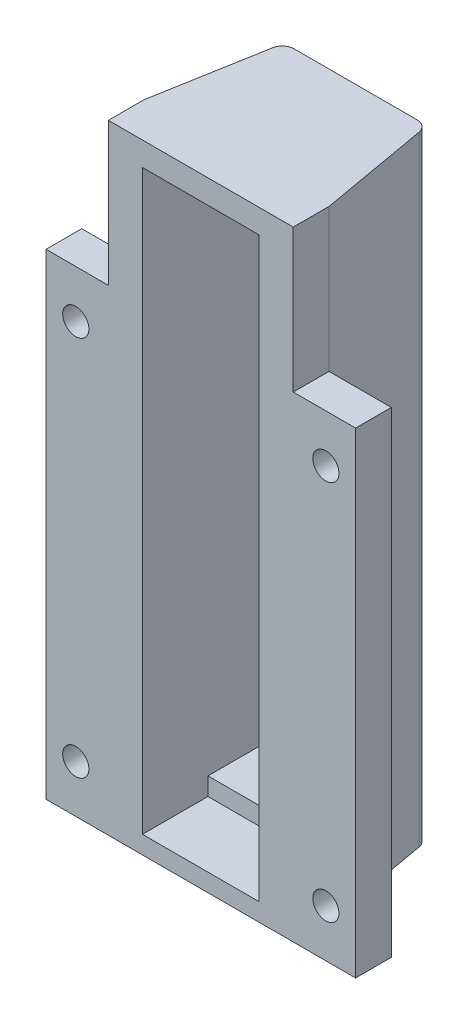
ISO-10303-21;
HEADER;
FILE_DESCRIPTION(('STEP AP214'),'2;1');
FILE_NAME('part.step','',(''),(''),'','','');
FILE_SCHEMA(('AUTOMOTIVE_DESIGN { 1 0 10303 214 1 1 1 1 }'));
ENDSEC;
DATA;
#1=APPLICATION_CONTEXT('core data for automotive mechanical design processes');
#2=APPLICATION_PROTOCOL_DEFINITION('international standard','automotive_design',2000,#1);
#3=PRODUCT_CONTEXT('',#1,'mechanical');
#4=PRODUCT('Part','Part','',(#3));
#5=PRODUCT_RELATED_PRODUCT_CATEGORY('part','',(#4));
#6=PRODUCT_DEFINITION_FORMATION('','',#4);
#7=PRODUCT_DEFINITION_CONTEXT('part definition',#1,'design');
#8=PRODUCT_DEFINITION('design','',#6,#7);
#9=PRODUCT_DEFINITION_SHAPE('','',#8);
#10=(LENGTH_UNIT() NAMED_UNIT(*) SI_UNIT(.MILLI.,.METRE.));
#11=(NAMED_UNIT(*) PLANE_ANGLE_UNIT() SI_UNIT($,.RADIAN.));
#12=(NAMED_UNIT(*) SI_UNIT($,.STERADIAN.) SOLID_ANGLE_UNIT());
#13=UNCERTAINTY_MEASURE_WITH_UNIT(LENGTH_MEASURE(1.E-05),#10,'distance_accuracy_value','');
#14=(GEOMETRIC_REPRESENTATION_CONTEXT(3) GLOBAL_UNCERTAINTY_ASSIGNED_CONTEXT((#13)) GLOBAL_UNIT_ASSIGNED_CONTEXT((#10,
#11,#12)) REPRESENTATION_CONTEXT('',''));
#15=CARTESIAN_POINT('',(0.,0.,0.));
#16=DIRECTION('',(0.,0.,1.));
#17=DIRECTION('',(1.,0.,0.));
#18=AXIS2_PLACEMENT_3D('',#15,#16,#17);
#19=CARTESIAN_POINT('',(0.,5.25,-11.5));
#20=DIRECTION('',(0.,0.,1.));
#21=DIRECTION('',(1.,0.,0.));
#22=AXIS2_PLACEMENT_3D('',#19,#20,#21);
#23=CYLINDRICAL_SURFACE('',#22,1.1);
#24=CARTESIAN_POINT('',(0.,5.25,-8.5));
#25=DIRECTION('',(0.,0.,1.));
#26=DIRECTION('',(-1.,0.,0.));
#27=AXIS2_PLACEMENT_3D('',#24,#25,#26);
#28=CIRCLE('',#27,1.1);
#29=CARTESIAN_POINT('',(-1.1,5.25,-8.5));
#30=VERTEX_POINT('',#29);
#31=EDGE_CURVE('E243',#30,#30,#28,.T.);
#32=ORIENTED_EDGE('',*,*,#31,.T.);
#33=EDGE_LOOP('',(#32));
#34=FACE_BOUND('',#33,.T.);
#35=CARTESIAN_POINT('',(0.,5.25,-10.3));
#36=DIRECTION('',(0.,0.,-1.));
#37=DIRECTION('',(-1.,0.,0.));
#38=AXIS2_PLACEMENT_3D('',#35,#36,#37);
#39=CIRCLE('',#38,1.1);
#40=CARTESIAN_POINT('',(-1.1,5.25,-10.3));
#41=VERTEX_POINT('',#40);
#42=EDGE_CURVE('E431',#41,#41,#39,.F.);
#43=ORIENTED_EDGE('',*,*,#42,.F.);
#44=EDGE_LOOP('',(#43));
#45=FACE_BOUND('',#44,.T.);
#46=ADVANCED_FACE('F42',(#34,#45),#23,.F.);
#47=CARTESIAN_POINT('',(0.,46.25,-11.5));
#48=DIRECTION('',(0.,0.,1.));
#49=DIRECTION('',(1.,0.,0.));
#50=AXIS2_PLACEMENT_3D('',#47,#48,#49);
#51=CYLINDRICAL_SURFACE('',#50,1.1);
#52=CARTESIAN_POINT('',(0.,46.25,-8.5));
#53=DIRECTION('',(0.,0.,1.));
#54=DIRECTION('',(1.,0.,0.));
#55=AXIS2_PLACEMENT_3D('',#52,#53,#54);
#56=CIRCLE('',#55,1.1);
#57=CARTESIAN_POINT('',(1.1,46.25,-8.5));
#58=VERTEX_POINT('',#57);
#59=EDGE_CURVE('E250',#58,#58,#56,.T.);
#60=ORIENTED_EDGE('',*,*,#59,.T.);
#61=EDGE_LOOP('',(#60));
#62=FACE_BOUND('',#61,.T.);
#63=CARTESIAN_POINT('',(0.,46.25,-10.3));
#64=DIRECTION('',(0.,0.,-1.));
#65=DIRECTION('',(-1.,0.,0.));
#66=AXIS2_PLACEMENT_3D('',#63,#64,#65);
#67=CIRCLE('',#66,1.1);
#68=CARTESIAN_POINT('',(-1.1,46.25,-10.3));
#69=VERTEX_POINT('',#68);
#70=EDGE_CURVE('E428',#69,#69,#67,.F.);
#71=ORIENTED_EDGE('',*,*,#70,.F.);
#72=EDGE_LOOP('',(#71));
#73=FACE_BOUND('',#72,.T.);
#74=ADVANCED_FACE('F494',(#62,#73),#51,.F.);
#75=CARTESIAN_POINT('',(0.,40.,-8.5));
#76=DIRECTION('',(0.,0.,-1.));
#77=DIRECTION('',(-1.,0.,0.));
#78=AXIS2_PLACEMENT_3D('',#75,#76,#77);
#79=PLANE('',#78);
#80=ORIENTED_EDGE('',*,*,#59,.F.);
#81=EDGE_LOOP('',(#80));
#82=FACE_BOUND('',#81,.T.);
#83=ORIENTED_EDGE('',*,*,#31,.F.);
#84=EDGE_LOOP('',(#83));
#85=FACE_BOUND('',#84,.T.);
#86=DIRECTION('',(0.,1.,0.));
#87=VECTOR('',#86,1.);
#88=CARTESIAN_POINT('',(4.89999999999999,3.,-8.49999999999999));
#89=LINE('',#88,#87);
#90=CARTESIAN_POINT('',(4.89999999999999,3.,-8.49999999999999));
#91=VERTEX_POINT('',#90);
#92=CARTESIAN_POINT('',(4.89999999999999,48.5,-8.49999999999999));
#93=VERTEX_POINT('',#92);
#94=EDGE_CURVE('E323',#91,#93,#89,.T.);
#95=ORIENTED_EDGE('',*,*,#94,.T.);
#96=DIRECTION('',(-1.,0.,0.));
#97=VECTOR('',#96,1.);
#98=CARTESIAN_POINT('',(-4.90000000000001,48.5,-8.49999999999999));
#99=LINE('',#98,#97);
#100=CARTESIAN_POINT('',(-4.90000000000001,48.5,-8.49999999999999));
#101=VERTEX_POINT('',#100);
#102=EDGE_CURVE('E318',#93,#101,#99,.T.);
#103=ORIENTED_EDGE('',*,*,#102,.T.);
#104=DIRECTION('',(0.,-1.,0.));
#105=VECTOR('',#104,1.);
#106=CARTESIAN_POINT('',(-4.90000000000001,3.,-8.49999999999999));
#107=LINE('',#106,#105);
#108=CARTESIAN_POINT('',(-4.90000000000001,3.,-8.49999999999999));
#109=VERTEX_POINT('',#108);
#110=EDGE_CURVE('E332',#101,#109,#107,.T.);
#111=ORIENTED_EDGE('',*,*,#110,.T.);
#112=DIRECTION('',(1.,0.,0.));
#113=VECTOR('',#112,1.);
#114=CARTESIAN_POINT('',(-4.90000000000001,3.,-8.49999999999999));
#115=LINE('',#114,#113);
#116=EDGE_CURVE('E328',#109,#91,#115,.T.);
#117=ORIENTED_EDGE('',*,*,#116,.T.);
#118=EDGE_LOOP('',(#95,#103,#111,#117));
#119=FACE_BOUND('',#118,.T.);
#120=DIRECTION('',(0.,1.,0.));
#121=VECTOR('',#120,1.);
#122=CARTESIAN_POINT('',(1.75,8.25,-8.5));
#123=LINE('',#122,#121);
#124=CARTESIAN_POINT('',(1.75,8.25,-8.5));
#125=VERTEX_POINT('',#124);
#126=CARTESIAN_POINT('',(1.75,43.25,-8.5));
#127=VERTEX_POINT('',#126);
#128=EDGE_CURVE('E219',#125,#127,#123,.T.);
#129=ORIENTED_EDGE('',*,*,#128,.F.);
#130=DIRECTION('',(1.,0.,0.));
#131=VECTOR('',#130,1.);
#132=CARTESIAN_POINT('',(-1.75,8.25,-8.5));
#133=LINE('',#132,#131);
#134=CARTESIAN_POINT('',(-1.75,8.25,-8.5));
#135=VERTEX_POINT('',#134);
#136=EDGE_CURVE('E237',#135,#125,#133,.T.);
#137=ORIENTED_EDGE('',*,*,#136,.F.);
#138=DIRECTION('',(0.,-1.,0.));
#139=VECTOR('',#138,1.);
#140=CARTESIAN_POINT('',(-1.75,8.25,-8.5));
#141=LINE('',#140,#139);
#142=CARTESIAN_POINT('',(-1.75,43.25,-8.5));
#143=VERTEX_POINT('',#142);
#144=EDGE_CURVE('E240',#143,#135,#141,.T.);
#145=ORIENTED_EDGE('',*,*,#144,.F.);
#146=DIRECTION('',(-1.,0.,0.));
#147=VECTOR('',#146,1.);
#148=CARTESIAN_POINT('',(-1.75,43.25,-8.5));
#149=LINE('',#148,#147);
#150=EDGE_CURVE('E249',#127,#143,#149,.T.);
#151=ORIENTED_EDGE('',*,*,#150,.F.);
#152=EDGE_LOOP('',(#129,#137,#145,#151));
#153=FACE_BOUND('',#152,.T.);
#154=ADVANCED_FACE('F500',(#82,#85,#119,#153),#79,.F.);
#155=CARTESIAN_POINT('',(0.,40.,0.));
#156=DIRECTION('',(0.,1.,0.));
#157=DIRECTION('',(0.,0.,1.));
#158=AXIS2_PLACEMENT_3D('',#155,#156,#157);
#159=PLANE('',#158);
#160=DIRECTION('',(0.,0.,-1.));
#161=VECTOR('',#160,1.);
#162=CARTESIAN_POINT('',(7.76326980708461,40.,1.5));
#163=LINE('',#162,#161);
#164=CARTESIAN_POINT('',(7.76326980708461,40.,1.5));
#165=VERTEX_POINT('',#164);
#166=CARTESIAN_POINT('',(7.76326980708461,40.,-1.5));
#167=VERTEX_POINT('',#166);
#168=EDGE_CURVE('E347',#165,#167,#163,.T.);
#169=ORIENTED_EDGE('',*,*,#168,.F.);
#170=DIRECTION('',(1.,0.,0.));
#171=VECTOR('',#170,1.);
#172=CARTESIAN_POINT('',(0.,40.,1.5));
#173=LINE('',#172,#171);
#174=CARTESIAN_POINT('',(13.,40.,1.5));
#175=VERTEX_POINT('',#174);
#176=EDGE_CURVE('E381',#165,#175,#173,.T.);
#177=ORIENTED_EDGE('',*,*,#176,.T.);
#178=DIRECTION('',(0.,0.,-1.));
#179=VECTOR('',#178,1.);
#180=CARTESIAN_POINT('',(13.,40.,0.));
#181=LINE('',#180,#179);
#182=CARTESIAN_POINT('',(13.,40.,-1.5));
#183=VERTEX_POINT('',#182);
#184=EDGE_CURVE('E384',#175,#183,#181,.T.);
#185=ORIENTED_EDGE('',*,*,#184,.T.);
#186=DIRECTION('',(1.,0.,0.));
#187=VECTOR('',#186,1.);
#188=CARTESIAN_POINT('',(0.,40.,-1.5));
#189=LINE('',#188,#187);
#190=EDGE_CURVE('E386',#167,#183,#189,.T.);
#191=ORIENTED_EDGE('',*,*,#190,.F.);
#192=EDGE_LOOP('',(#169,#177,#185,#191));
#193=FACE_BOUND('',#192,.T.);
#194=ADVANCED_FACE('F567',(#193),#159,.T.);
#195=CARTESIAN_POINT('',(0.,40.,-11.5));
#196=DIRECTION('',(0.,0.,-1.));
#197=DIRECTION('',(-1.,0.,0.));
#198=AXIS2_PLACEMENT_3D('',#195,#196,#197);
#199=PLANE('',#198);
#200=CARTESIAN_POINT('',(0.,46.25,-11.5));
#201=DIRECTION('',(0.,0.,-1.));
#202=DIRECTION('',(-1.,0.,0.));
#203=AXIS2_PLACEMENT_3D('',#200,#201,#202);
#204=CIRCLE('',#203,1.95);
#205=CARTESIAN_POINT('',(-1.95,46.25,-11.5));
#206=VERTEX_POINT('',#205);
#207=EDGE_CURVE('E611',#206,#206,#204,.T.);
#208=ORIENTED_EDGE('',*,*,#207,.F.);
#209=EDGE_LOOP('',(#208));
#210=FACE_BOUND('',#209,.T.);
#211=CARTESIAN_POINT('',(0.,5.25,-11.5));
#212=DIRECTION('',(0.,0.,-1.));
#213=DIRECTION('',(-1.,0.,0.));
#214=AXIS2_PLACEMENT_3D('',#211,#212,#213);
#215=CIRCLE('',#214,1.95);
#216=CARTESIAN_POINT('',(-1.95,5.25,-11.5));
#217=VERTEX_POINT('',#216);
#218=EDGE_CURVE('E614',#217,#217,#215,.T.);
#219=ORIENTED_EDGE('',*,*,#218,.F.);
#220=EDGE_LOOP('',(#219));
#221=FACE_BOUND('',#220,.T.);
#222=DIRECTION('',(0.,1.,0.));
#223=VECTOR('',#222,1.);
#224=CARTESIAN_POINT('',(1.75,8.25,-11.5));
#225=LINE('',#224,#223);
#226=CARTESIAN_POINT('',(1.75,8.25,-11.5));
#227=VERTEX_POINT('',#226);
#228=CARTESIAN_POINT('',(1.75,43.25,-11.5));
#229=VERTEX_POINT('',#228);
#230=EDGE_CURVE('E216',#227,#229,#225,.T.);
#231=ORIENTED_EDGE('',*,*,#230,.T.);
#232=DIRECTION('',(-1.,0.,0.));
#233=VECTOR('',#232,1.);
#234=CARTESIAN_POINT('',(-1.75,43.25,-11.5));
#235=LINE('',#234,#233);
#236=CARTESIAN_POINT('',(-1.75,43.25,-11.5));
#237=VERTEX_POINT('',#236);
#238=EDGE_CURVE('E228',#229,#237,#235,.T.);
#239=ORIENTED_EDGE('',*,*,#238,.T.);
#240=DIRECTION('',(0.,-1.,0.));
#241=VECTOR('',#240,1.);
#242=CARTESIAN_POINT('',(-1.75,8.25,-11.5));
#243=LINE('',#242,#241);
#244=CARTESIAN_POINT('',(-1.75,8.25,-11.5));
#245=VERTEX_POINT('',#244);
#246=EDGE_CURVE('E232',#237,#245,#243,.T.);
#247=ORIENTED_EDGE('',*,*,#246,.T.);
#248=DIRECTION('',(1.,0.,0.));
#249=VECTOR('',#248,1.);
#250=CARTESIAN_POINT('',(-1.75,8.25,-11.5));
#251=LINE('',#250,#249);
#252=EDGE_CURVE('E224',#245,#227,#251,.T.);
#253=ORIENTED_EDGE('',*,*,#252,.T.);
#254=EDGE_LOOP('',(#231,#239,#247,#253));
#255=FACE_BOUND('',#254,.T.);
#256=DIRECTION('',(-1.,0.,0.));
#257=VECTOR('',#256,1.);
#258=CARTESIAN_POINT('',(-6.,52.,-11.5));
#259=LINE('',#258,#257);
#260=CARTESIAN_POINT('',(5.16090036882272,52.,-11.5));
#261=VERTEX_POINT('',#260);
#262=CARTESIAN_POINT('',(-5.16090036882272,52.,-11.5));
#263=VERTEX_POINT('',#262);
#264=EDGE_CURVE('E344',#261,#263,#259,.T.);
#265=ORIENTED_EDGE('',*,*,#264,.F.);
#266=DIRECTION('',(0.,-1.,0.));
#267=VECTOR('',#266,1.);
#268=CARTESIAN_POINT('',(5.16090036882272,40.,-11.5));
#269=LINE('',#268,#267);
#270=CARTESIAN_POINT('',(5.16090036882272,0.,-11.5));
#271=VERTEX_POINT('',#270);
#272=EDGE_CURVE('E436',#261,#271,#269,.T.);
#273=ORIENTED_EDGE('',*,*,#272,.T.);
#274=DIRECTION('',(1.,0.,0.));
#275=VECTOR('',#274,1.);
#276=CARTESIAN_POINT('',(0.,0.,-11.5));
#277=LINE('',#276,#275);
#278=CARTESIAN_POINT('',(-5.16090036882272,0.,-11.5));
#279=VERTEX_POINT('',#278);
#280=EDGE_CURVE('E373',#279,#271,#277,.T.);
#281=ORIENTED_EDGE('',*,*,#280,.F.);
#282=DIRECTION('',(0.,-1.,0.));
#283=VECTOR('',#282,1.);
#284=CARTESIAN_POINT('',(-5.16090036882272,52.,-11.5));
#285=LINE('',#284,#283);
#286=EDGE_CURVE('E423',#279,#263,#285,.F.);
#287=ORIENTED_EDGE('',*,*,#286,.T.);
#288=EDGE_LOOP('',(#265,#273,#281,#287));
#289=FACE_BOUND('',#288,.T.);
#290=ADVANCED_FACE('F234',(#210,#221,#255,#289),#199,.T.);
#291=CARTESIAN_POINT('',(-7.78569368648029,40.,-1.372827860458));
#292=DIRECTION('',(0.984807753012209,0.,0.173648177666927));
#293=DIRECTION('',(0.173648177666927,0.,-0.984807753012209));
#294=AXIS2_PLACEMENT_3D('',#291,#292,#293);
#295=PLANE('',#294);
#296=DIRECTION('',(-0.173648177666927,0.,0.984807753012209));
#297=VECTOR('',#296,1.);
#298=CARTESIAN_POINT('',(-6.,52.,-11.5));
#299=LINE('',#298,#297);
#300=CARTESIAN_POINT('',(-6.14570812183493,52.,-10.6736481776669));
#301=VERTEX_POINT('',#300);
#302=CARTESIAN_POINT('',(-7.76326980708461,52.,-1.5));
#303=VERTEX_POINT('',#302);
#304=EDGE_CURVE('E346',#301,#303,#299,.T.);
#305=ORIENTED_EDGE('',*,*,#304,.F.);
#306=DIRECTION('',(0.,-1.,0.));
#307=VECTOR('',#306,1.);
#308=CARTESIAN_POINT('',(-6.14570812183492,0.,-10.6736481776669));
#309=LINE('',#308,#307);
#310=CARTESIAN_POINT('',(-6.14570812183492,0.,-10.6736481776669));
#311=VERTEX_POINT('',#310);
#312=EDGE_CURVE('E13',#301,#311,#309,.T.);
#313=ORIENTED_EDGE('',*,*,#312,.T.);
#314=DIRECTION('',(-0.173648177666927,0.,0.984807753012209));
#315=VECTOR('',#314,1.);
#316=CARTESIAN_POINT('',(-7.78569368648029,0.,-1.372827860458));
#317=LINE('',#316,#315);
#318=CARTESIAN_POINT('',(-7.76326980708461,0.,-1.5));
#319=VERTEX_POINT('',#318);
#320=EDGE_CURVE('E392',#311,#319,#317,.T.);
#321=ORIENTED_EDGE('',*,*,#320,.T.);
#322=DIRECTION('',(0.,-1.,0.));
#323=VECTOR('',#322,1.);
#324=CARTESIAN_POINT('',(-7.76326980708461,40.,-1.5));
#325=LINE('',#324,#323);
#326=CARTESIAN_POINT('',(-7.76326980708461,40.,-1.5));
#327=VERTEX_POINT('',#326);
#328=EDGE_CURVE('E420',#327,#319,#325,.T.);
#329=ORIENTED_EDGE('',*,*,#328,.F.);
#330=DIRECTION('',(0.,-1.,0.));
#331=VECTOR('',#330,1.);
#332=CARTESIAN_POINT('',(-7.76326980708461,52.,-1.5));
#333=LINE('',#332,#331);
#334=EDGE_CURVE('E370',#303,#327,#333,.T.);
#335=ORIENTED_EDGE('',*,*,#334,.F.);
#336=EDGE_LOOP('',(#305,#313,#321,#329,#335));
#337=FACE_BOUND('',#336,.T.);
#338=ADVANCED_FACE('F484',(#337),#295,.F.);
#339=CARTESIAN_POINT('',(0.,40.,-1.5));
#340=DIRECTION('',(0.,0.,-1.));
#341=DIRECTION('',(-1.,0.,0.));
#342=AXIS2_PLACEMENT_3D('',#339,#340,#341);
#343=PLANE('',#342);
#344=CARTESIAN_POINT('',(-10.5,4.,-1.5));
#345=DIRECTION('',(0.,0.,-1.));
#346=DIRECTION('',(-1.,0.,0.));
#347=AXIS2_PLACEMENT_3D('',#344,#345,#346);
#348=CIRCLE('',#347,1.1);
#349=CARTESIAN_POINT('',(-11.6,4.,-1.5));
#350=VERTEX_POINT('',#349);
#351=EDGE_CURVE('E275',#350,#350,#348,.T.);
#352=ORIENTED_EDGE('',*,*,#351,.F.);
#353=EDGE_LOOP('',(#352));
#354=FACE_BOUND('',#353,.T.);
#355=CARTESIAN_POINT('',(-10.5,36.,-1.5));
#356=DIRECTION('',(0.,0.,-1.));
#357=DIRECTION('',(-1.,0.,0.));
#358=AXIS2_PLACEMENT_3D('',#355,#356,#357);
#359=CIRCLE('',#358,1.1);
#360=CARTESIAN_POINT('',(-11.6,36.,-1.5));
#361=VERTEX_POINT('',#360);
#362=EDGE_CURVE('E272',#361,#361,#359,.T.);
#363=ORIENTED_EDGE('',*,*,#362,.F.);
#364=EDGE_LOOP('',(#363));
#365=FACE_BOUND('',#364,.T.);
#366=DIRECTION('',(1.,0.,0.));
#367=VECTOR('',#366,1.);
#368=CARTESIAN_POINT('',(0.,0.,-1.5));
#369=LINE('',#368,#367);
#370=CARTESIAN_POINT('',(-13.,0.,-1.5));
#371=VERTEX_POINT('',#370);
#372=EDGE_CURVE('E394',#371,#319,#369,.T.);
#373=ORIENTED_EDGE('',*,*,#372,.F.);
#374=DIRECTION('',(0.,-1.,0.));
#375=VECTOR('',#374,1.);
#376=CARTESIAN_POINT('',(-13.,40.,-1.5));
#377=LINE('',#376,#375);
#378=CARTESIAN_POINT('',(-13.,40.,-1.5));
#379=VERTEX_POINT('',#378);
#380=EDGE_CURVE('E418',#379,#371,#377,.T.);
#381=ORIENTED_EDGE('',*,*,#380,.F.);
#382=DIRECTION('',(1.,0.,0.));
#383=VECTOR('',#382,1.);
#384=CARTESIAN_POINT('',(0.,40.,-1.5));
#385=LINE('',#384,#383);
#386=EDGE_CURVE('E374',#379,#327,#385,.T.);
#387=ORIENTED_EDGE('',*,*,#386,.T.);
#388=ORIENTED_EDGE('',*,*,#328,.T.);
#389=EDGE_LOOP('',(#373,#381,#387,#388));
#390=FACE_BOUND('',#389,.T.);
#391=ADVANCED_FACE('F479',(#354,#365,#390),#343,.T.);
#392=CARTESIAN_POINT('',(-13.,40.,0.));
#393=DIRECTION('',(-1.,0.,0.));
#394=DIRECTION('',(0.,0.,1.));
#395=AXIS2_PLACEMENT_3D('',#392,#393,#394);
#396=PLANE('',#395);
#397=DIRECTION('',(0.,0.,-1.));
#398=VECTOR('',#397,1.);
#399=CARTESIAN_POINT('',(-13.,0.,0.));
#400=LINE('',#399,#398);
#401=CARTESIAN_POINT('',(-13.,0.,1.5));
#402=VERTEX_POINT('',#401);
#403=EDGE_CURVE('E397',#402,#371,#400,.T.);
#404=ORIENTED_EDGE('',*,*,#403,.F.);
#405=DIRECTION('',(0.,-1.,0.));
#406=VECTOR('',#405,1.);
#407=CARTESIAN_POINT('',(-13.,40.,1.5));
#408=LINE('',#407,#406);
#409=CARTESIAN_POINT('',(-13.,40.,1.5));
#410=VERTEX_POINT('',#409);
#411=EDGE_CURVE('E416',#410,#402,#408,.T.);
#412=ORIENTED_EDGE('',*,*,#411,.F.);
#413=DIRECTION('',(0.,0.,-1.));
#414=VECTOR('',#413,1.);
#415=CARTESIAN_POINT('',(-13.,40.,0.));
#416=LINE('',#415,#414);
#417=EDGE_CURVE('E377',#410,#379,#416,.T.);
#418=ORIENTED_EDGE('',*,*,#417,.T.);
#419=ORIENTED_EDGE('',*,*,#380,.T.);
#420=EDGE_LOOP('',(#404,#412,#418,#419));
#421=FACE_BOUND('',#420,.T.);
#422=ADVANCED_FACE('F475',(#421),#396,.T.);
#423=CARTESIAN_POINT('',(0.,40.,1.5));
#424=DIRECTION('',(0.,0.,-1.));
#425=DIRECTION('',(-1.,0.,0.));
#426=AXIS2_PLACEMENT_3D('',#423,#424,#425);
#427=PLANE('',#426);
#428=CARTESIAN_POINT('',(10.5,36.,1.5));
#429=DIRECTION('',(0.,0.,1.));
#430=DIRECTION('',(-1.,0.,0.));
#431=AXIS2_PLACEMENT_3D('',#428,#429,#430);
#432=CIRCLE('',#431,1.1);
#433=CARTESIAN_POINT('',(9.4,36.,1.5));
#434=VERTEX_POINT('',#433);
#435=EDGE_CURVE('E255',#434,#434,#432,.T.);
#436=ORIENTED_EDGE('',*,*,#435,.F.);
#437=EDGE_LOOP('',(#436));
#438=FACE_BOUND('',#437,.T.);
#439=CARTESIAN_POINT('',(10.5,4.,1.5));
#440=DIRECTION('',(0.,0.,1.));
#441=DIRECTION('',(1.,0.,0.));
#442=AXIS2_PLACEMENT_3D('',#439,#440,#441);
#443=CIRCLE('',#442,1.1);
#444=CARTESIAN_POINT('',(11.6,4.,1.5));
#445=VERTEX_POINT('',#444);
#446=EDGE_CURVE('E264',#445,#445,#443,.T.);
#447=ORIENTED_EDGE('',*,*,#446,.F.);
#448=EDGE_LOOP('',(#447));
#449=FACE_BOUND('',#448,.T.);
#450=CARTESIAN_POINT('',(-10.5,4.,1.5));
#451=DIRECTION('',(0.,0.,1.));
#452=DIRECTION('',(-1.,0.,0.));
#453=AXIS2_PLACEMENT_3D('',#450,#451,#452);
#454=CIRCLE('',#453,1.1);
#455=CARTESIAN_POINT('',(-11.6,4.,1.5));
#456=VERTEX_POINT('',#455);
#457=EDGE_CURVE('E260',#456,#456,#454,.T.);
#458=ORIENTED_EDGE('',*,*,#457,.F.);
#459=EDGE_LOOP('',(#458));
#460=FACE_BOUND('',#459,.T.);
#461=CARTESIAN_POINT('',(-10.5,36.,1.5));
#462=DIRECTION('',(0.,0.,1.));
#463=DIRECTION('',(1.,0.,0.));
#464=AXIS2_PLACEMENT_3D('',#461,#462,#463);
#465=CIRCLE('',#464,1.1);
#466=CARTESIAN_POINT('',(-9.4,36.,1.5));
#467=VERTEX_POINT('',#466);
#468=EDGE_CURVE('E263',#467,#467,#465,.T.);
#469=ORIENTED_EDGE('',*,*,#468,.F.);
#470=EDGE_LOOP('',(#469));
#471=FACE_BOUND('',#470,.T.);
#472=DIRECTION('',(0.,-1.,0.));
#473=VECTOR('',#472,1.);
#474=CARTESIAN_POINT('',(-4.90000000000001,3.,1.5));
#475=LINE('',#474,#473);
#476=CARTESIAN_POINT('',(-4.90000000000001,50.,1.5));
#477=VERTEX_POINT('',#476);
#478=CARTESIAN_POINT('',(-4.90000000000001,1.50000000000001,1.5));
#479=VERTEX_POINT('',#478);
#480=EDGE_CURVE('E316',#477,#479,#475,.T.);
#481=ORIENTED_EDGE('',*,*,#480,.F.);
#482=DIRECTION('',(-1.,0.,0.));
#483=VECTOR('',#482,1.);
#484=CARTESIAN_POINT('',(-4.90000000000001,50.,1.5));
#485=LINE('',#484,#483);
#486=CARTESIAN_POINT('',(4.90000000000001,50.,1.5));
#487=VERTEX_POINT('',#486);
#488=EDGE_CURVE('E279',#487,#477,#485,.T.);
#489=ORIENTED_EDGE('',*,*,#488,.F.);
#490=DIRECTION('',(0.,1.,0.));
#491=VECTOR('',#490,1.);
#492=CARTESIAN_POINT('',(4.89999999999999,3.,1.5));
#493=LINE('',#492,#491);
#494=CARTESIAN_POINT('',(4.90000000000001,1.50000000000001,1.5));
#495=VERTEX_POINT('',#494);
#496=EDGE_CURVE('E315',#495,#487,#493,.T.);
#497=ORIENTED_EDGE('',*,*,#496,.F.);
#498=DIRECTION('',(1.,0.,0.));
#499=VECTOR('',#498,1.);
#500=CARTESIAN_POINT('',(-4.90000000000001,1.50000000000001,1.5));
#501=LINE('',#500,#499);
#502=EDGE_CURVE('E280',#479,#495,#501,.T.);
#503=ORIENTED_EDGE('',*,*,#502,.F.);
#504=EDGE_LOOP('',(#481,#489,#497,#503));
#505=FACE_BOUND('',#504,.T.);
#506=DIRECTION('',(1.,0.,0.));
#507=VECTOR('',#506,1.);
#508=CARTESIAN_POINT('',(0.,0.,1.5));
#509=LINE('',#508,#507);
#510=CARTESIAN_POINT('',(13.,0.,1.5));
#511=VERTEX_POINT('',#510);
#512=EDGE_CURVE('E400',#402,#511,#509,.T.);
#513=ORIENTED_EDGE('',*,*,#512,.T.);
#514=DIRECTION('',(0.,-1.,0.));
#515=VECTOR('',#514,1.);
#516=CARTESIAN_POINT('',(13.,40.,1.5));
#517=LINE('',#516,#515);
#518=EDGE_CURVE('E413',#175,#511,#517,.T.);
#519=ORIENTED_EDGE('',*,*,#518,.F.);
#520=ORIENTED_EDGE('',*,*,#176,.F.);
#521=DIRECTION('',(0.,-1.,0.));
#522=VECTOR('',#521,1.);
#523=CARTESIAN_POINT('',(7.76326980708461,52.,1.5));
#524=LINE('',#523,#522);
#525=CARTESIAN_POINT('',(7.76326980708461,52.,1.5));
#526=VERTEX_POINT('',#525);
#527=EDGE_CURVE('E364',#526,#165,#524,.T.);
#528=ORIENTED_EDGE('',*,*,#527,.F.);
#529=DIRECTION('',(1.,0.,0.));
#530=VECTOR('',#529,1.);
#531=CARTESIAN_POINT('',(-7.76326980708461,52.,1.5));
#532=LINE('',#531,#530);
#533=CARTESIAN_POINT('',(-7.76326980708461,52.,1.5));
#534=VERTEX_POINT('',#533);
#535=EDGE_CURVE('E351',#534,#526,#532,.T.);
#536=ORIENTED_EDGE('',*,*,#535,.F.);
#537=DIRECTION('',(0.,-1.,0.));
#538=VECTOR('',#537,1.);
#539=CARTESIAN_POINT('',(-7.76326980708461,52.,1.5));
#540=LINE('',#539,#538);
#541=CARTESIAN_POINT('',(-7.76326980708461,40.,1.5));
#542=VERTEX_POINT('',#541);
#543=EDGE_CURVE('E367',#534,#542,#540,.T.);
#544=ORIENTED_EDGE('',*,*,#543,.T.);
#545=EDGE_CURVE('E382',#410,#542,#173,.T.);
#546=ORIENTED_EDGE('',*,*,#545,.F.);
#547=ORIENTED_EDGE('',*,*,#411,.T.);
#548=EDGE_LOOP('',(#513,#519,#520,#528,#536,#544,#546,#547));
#549=FACE_BOUND('',#548,.T.);
#550=ADVANCED_FACE('F470',(#438,#449,#460,#471,#505,#549),#427,.F.);
#551=CARTESIAN_POINT('',(13.,40.,0.));
#552=DIRECTION('',(-1.,0.,0.));
#553=DIRECTION('',(0.,0.,1.));
#554=AXIS2_PLACEMENT_3D('',#551,#552,#553);
#555=PLANE('',#554);
#556=DIRECTION('',(0.,0.,-1.));
#557=VECTOR('',#556,1.);
#558=CARTESIAN_POINT('',(13.,0.,0.));
#559=LINE('',#558,#557);
#560=CARTESIAN_POINT('',(13.,0.,-1.5));
#561=VERTEX_POINT('',#560);
#562=EDGE_CURVE('E402',#511,#561,#559,.T.);
#563=ORIENTED_EDGE('',*,*,#562,.T.);
#564=DIRECTION('',(0.,-1.,0.));
#565=VECTOR('',#564,1.);
#566=CARTESIAN_POINT('',(13.,40.,-1.5));
#567=LINE('',#566,#565);
#568=EDGE_CURVE('E411',#183,#561,#567,.T.);
#569=ORIENTED_EDGE('',*,*,#568,.F.);
#570=ORIENTED_EDGE('',*,*,#184,.F.);
#571=ORIENTED_EDGE('',*,*,#518,.T.);
#572=EDGE_LOOP('',(#563,#569,#570,#571));
#573=FACE_BOUND('',#572,.T.);
#574=ADVANCED_FACE('F465',(#573),#555,.F.);
#575=CARTESIAN_POINT('',(0.,40.,-1.5));
#576=DIRECTION('',(0.,0.,-1.));
#577=DIRECTION('',(-1.,0.,0.));
#578=AXIS2_PLACEMENT_3D('',#575,#576,#577);
#579=PLANE('',#578);
#580=CARTESIAN_POINT('',(10.5,36.,-1.5));
#581=DIRECTION('',(0.,0.,-1.));
#582=DIRECTION('',(-1.,0.,0.));
#583=AXIS2_PLACEMENT_3D('',#580,#581,#582);
#584=CIRCLE('',#583,1.1);
#585=CARTESIAN_POINT('',(9.4,36.,-1.5));
#586=VERTEX_POINT('',#585);
#587=EDGE_CURVE('E276',#586,#586,#584,.T.);
#588=ORIENTED_EDGE('',*,*,#587,.F.);
#589=EDGE_LOOP('',(#588));
#590=FACE_BOUND('',#589,.T.);
#591=CARTESIAN_POINT('',(10.5,4.,-1.5));
#592=DIRECTION('',(0.,0.,-1.));
#593=DIRECTION('',(-1.,0.,0.));
#594=AXIS2_PLACEMENT_3D('',#591,#592,#593);
#595=CIRCLE('',#594,1.1);
#596=CARTESIAN_POINT('',(9.4,4.,-1.5));
#597=VERTEX_POINT('',#596);
#598=EDGE_CURVE('E271',#597,#597,#595,.T.);
#599=ORIENTED_EDGE('',*,*,#598,.F.);
#600=EDGE_LOOP('',(#599));
#601=FACE_BOUND('',#600,.T.);
#602=DIRECTION('',(1.,0.,0.));
#603=VECTOR('',#602,1.);
#604=CARTESIAN_POINT('',(0.,0.,-1.5));
#605=LINE('',#604,#603);
#606=CARTESIAN_POINT('',(7.76326980708461,0.,-1.5));
#607=VERTEX_POINT('',#606);
#608=EDGE_CURVE('E405',#607,#561,#605,.T.);
#609=ORIENTED_EDGE('',*,*,#608,.F.);
#610=DIRECTION('',(0.,-1.,0.));
#611=VECTOR('',#610,1.);
#612=CARTESIAN_POINT('',(7.76326980708461,40.,-1.5));
#613=LINE('',#612,#611);
#614=EDGE_CURVE('E389',#167,#607,#613,.T.);
#615=ORIENTED_EDGE('',*,*,#614,.F.);
#616=ORIENTED_EDGE('',*,*,#190,.T.);
#617=ORIENTED_EDGE('',*,*,#568,.T.);
#618=EDGE_LOOP('',(#609,#615,#616,#617));
#619=FACE_BOUND('',#618,.T.);
#620=ADVANCED_FACE('F459',(#590,#601,#619),#579,.T.);
#621=CARTESIAN_POINT('',(7.78569368648029,40.,-1.372827860458));
#622=DIRECTION('',(0.984807753012209,0.,-0.173648177666927));
#623=DIRECTION('',(-0.173648177666927,0.,-0.984807753012209));
#624=AXIS2_PLACEMENT_3D('',#621,#622,#623);
#625=PLANE('',#624);
#626=DIRECTION('',(0.173648177666927,0.,0.984807753012209));
#627=VECTOR('',#626,1.);
#628=CARTESIAN_POINT('',(7.78569368648029,0.,-1.372827860458));
#629=LINE('',#628,#627);
#630=CARTESIAN_POINT('',(6.14570812183492,0.,-10.6736481776669));
#631=VERTEX_POINT('',#630);
#632=EDGE_CURVE('E378',#631,#607,#629,.T.);
#633=ORIENTED_EDGE('',*,*,#632,.F.);
#634=DIRECTION('',(0.,-1.,0.));
#635=VECTOR('',#634,1.);
#636=CARTESIAN_POINT('',(6.14570812183492,40.,-10.6736481776669));
#637=LINE('',#636,#635);
#638=CARTESIAN_POINT('',(6.14570812183493,52.,-10.6736481776669));
#639=VERTEX_POINT('',#638);
#640=EDGE_CURVE('E65',#631,#639,#637,.F.);
#641=ORIENTED_EDGE('',*,*,#640,.T.);
#642=DIRECTION('',(-0.173648177666927,0.,-0.984807753012209));
#643=VECTOR('',#642,1.);
#644=CARTESIAN_POINT('',(6.,52.,-11.5));
#645=LINE('',#644,#643);
#646=CARTESIAN_POINT('',(7.76326980708461,52.,-1.5));
#647=VERTEX_POINT('',#646);
#648=EDGE_CURVE('E355',#647,#639,#645,.T.);
#649=ORIENTED_EDGE('',*,*,#648,.F.);
#650=DIRECTION('',(0.,-1.,0.));
#651=VECTOR('',#650,1.);
#652=CARTESIAN_POINT('',(7.76326980708461,52.,-1.5));
#653=LINE('',#652,#651);
#654=EDGE_CURVE('E357',#647,#167,#653,.T.);
#655=ORIENTED_EDGE('',*,*,#654,.T.);
#656=ORIENTED_EDGE('',*,*,#614,.T.);
#657=EDGE_LOOP('',(#633,#641,#649,#655,#656));
#658=FACE_BOUND('',#657,.T.);
#659=ADVANCED_FACE('F454',(#658),#625,.T.);
#660=DIRECTION('',(0.,0.,1.));
#661=VECTOR('',#660,1.);
#662=CARTESIAN_POINT('',(-7.76326980708461,40.,-1.5));
#663=LINE('',#662,#661);
#664=EDGE_CURVE('E343',#327,#542,#663,.T.);
#665=ORIENTED_EDGE('',*,*,#664,.F.);
#666=ORIENTED_EDGE('',*,*,#386,.F.);
#667=ORIENTED_EDGE('',*,*,#417,.F.);
#668=ORIENTED_EDGE('',*,*,#545,.T.);
#669=EDGE_LOOP('',(#665,#666,#667,#668));
#670=FACE_BOUND('',#669,.T.);
#671=ADVANCED_FACE('F579',(#670),#159,.T.);
#672=CARTESIAN_POINT('',(0.,0.,0.));
#673=DIRECTION('',(0.,1.,0.));
#674=DIRECTION('',(0.,0.,1.));
#675=AXIS2_PLACEMENT_3D('',#672,#673,#674);
#676=PLANE('',#675);
#677=ORIENTED_EDGE('',*,*,#280,.T.);
#678=CARTESIAN_POINT('',(5.16090036882272,0.,-10.5));
#679=DIRECTION('',(0.,1.,0.));
#680=DIRECTION('',(0.,0.,1.));
#681=AXIS2_PLACEMENT_3D('',#678,#679,#680);
#682=CIRCLE('',#681,1.);
#683=EDGE_CURVE('E441',#271,#631,#682,.F.);
#684=ORIENTED_EDGE('',*,*,#683,.T.);
#685=ORIENTED_EDGE('',*,*,#632,.T.);
#686=ORIENTED_EDGE('',*,*,#608,.T.);
#687=ORIENTED_EDGE('',*,*,#562,.F.);
#688=ORIENTED_EDGE('',*,*,#512,.F.);
#689=ORIENTED_EDGE('',*,*,#403,.T.);
#690=ORIENTED_EDGE('',*,*,#372,.T.);
#691=ORIENTED_EDGE('',*,*,#320,.F.);
#692=CARTESIAN_POINT('',(-5.16090036882272,0.,-10.5));
#693=DIRECTION('',(0.,1.,0.));
#694=DIRECTION('',(0.,0.,1.));
#695=AXIS2_PLACEMENT_3D('',#692,#693,#694);
#696=CIRCLE('',#695,1.);
#697=EDGE_CURVE('E439',#311,#279,#696,.F.);
#698=ORIENTED_EDGE('',*,*,#697,.T.);
#699=EDGE_LOOP('',(#677,#684,#685,#686,#687,#688,#689,#690,#691,#698));
#700=FACE_BOUND('',#699,.T.);
#701=ADVANCED_FACE('F453',(#700),#676,.F.);
#702=CARTESIAN_POINT('',(-7.76326980708461,52.,-1.5));
#703=DIRECTION('',(1.,0.,0.));
#704=DIRECTION('',(0.,0.,-1.));
#705=AXIS2_PLACEMENT_3D('',#702,#703,#704);
#706=PLANE('',#705);
#707=ORIENTED_EDGE('',*,*,#664,.T.);
#708=ORIENTED_EDGE('',*,*,#543,.F.);
#709=DIRECTION('',(0.,0.,1.));
#710=VECTOR('',#709,1.);
#711=CARTESIAN_POINT('',(-7.76326980708461,52.,-1.5));
#712=LINE('',#711,#710);
#713=EDGE_CURVE('E349',#303,#534,#712,.T.);
#714=ORIENTED_EDGE('',*,*,#713,.F.);
#715=ORIENTED_EDGE('',*,*,#334,.T.);
#716=EDGE_LOOP('',(#707,#708,#714,#715));
#717=FACE_BOUND('',#716,.T.);
#718=ADVANCED_FACE('F574',(#717),#706,.F.);
#719=CARTESIAN_POINT('',(7.76326980708461,52.,1.5));
#720=DIRECTION('',(-1.,0.,0.));
#721=DIRECTION('',(0.,0.,1.));
#722=AXIS2_PLACEMENT_3D('',#719,#720,#721);
#723=PLANE('',#722);
#724=ORIENTED_EDGE('',*,*,#168,.T.);
#725=ORIENTED_EDGE('',*,*,#654,.F.);
#726=DIRECTION('',(0.,0.,-1.));
#727=VECTOR('',#726,1.);
#728=CARTESIAN_POINT('',(7.76326980708461,52.,1.5));
#729=LINE('',#728,#727);
#730=EDGE_CURVE('E353',#526,#647,#729,.T.);
#731=ORIENTED_EDGE('',*,*,#730,.F.);
#732=ORIENTED_EDGE('',*,*,#527,.T.);
#733=EDGE_LOOP('',(#724,#725,#731,#732));
#734=FACE_BOUND('',#733,.T.);
#735=ADVANCED_FACE('F571',(#734),#723,.F.);
#736=CARTESIAN_POINT('',(0.,52.,0.));
#737=DIRECTION('',(0.,1.,0.));
#738=DIRECTION('',(0.,0.,1.));
#739=AXIS2_PLACEMENT_3D('',#736,#737,#738);
#740=PLANE('',#739);
#741=ORIENTED_EDGE('',*,*,#648,.T.);
#742=CARTESIAN_POINT('',(5.16090036882272,52.,-10.5));
#743=DIRECTION('',(0.,1.,0.));
#744=DIRECTION('',(0.,0.,1.));
#745=AXIS2_PLACEMENT_3D('',#742,#743,#744);
#746=CIRCLE('',#745,1.);
#747=EDGE_CURVE('E50',#639,#261,#746,.T.);
#748=ORIENTED_EDGE('',*,*,#747,.T.);
#749=ORIENTED_EDGE('',*,*,#264,.T.);
#750=CARTESIAN_POINT('',(-5.16090036882272,52.,-10.5));
#751=DIRECTION('',(0.,1.,0.));
#752=DIRECTION('',(0.,0.,1.));
#753=AXIS2_PLACEMENT_3D('',#750,#751,#752);
#754=CIRCLE('',#753,1.);
#755=EDGE_CURVE('E57',#263,#301,#754,.T.);
#756=ORIENTED_EDGE('',*,*,#755,.T.);
#757=ORIENTED_EDGE('',*,*,#304,.T.);
#758=ORIENTED_EDGE('',*,*,#713,.T.);
#759=ORIENTED_EDGE('',*,*,#535,.T.);
#760=ORIENTED_EDGE('',*,*,#730,.T.);
#761=EDGE_LOOP('',(#741,#748,#749,#756,#757,#758,#759,#760));
#762=FACE_BOUND('',#761,.T.);
#763=ADVANCED_FACE('F446',(#762),#740,.T.);
#764=CARTESIAN_POINT('',(-4.90000000000001,48.5,-58.043420587662));
#765=DIRECTION('',(0.,1.,0.));
#766=DIRECTION('',(0.,0.,1.));
#767=AXIS2_PLACEMENT_3D('',#764,#765,#766);
#768=PLANE('',#767);
#769=DIRECTION('',(0.,0.,1.));
#770=VECTOR('',#769,1.);
#771=CARTESIAN_POINT('',(4.89999999999999,48.5,-58.043420587662));
#772=LINE('',#771,#770);
#773=CARTESIAN_POINT('',(4.89999999999999,48.5,-4.));
#774=VERTEX_POINT('',#773);
#775=EDGE_CURVE('E326',#93,#774,#772,.T.);
#776=ORIENTED_EDGE('',*,*,#775,.T.);
#777=DIRECTION('',(-1.,0.,0.));
#778=VECTOR('',#777,1.);
#779=CARTESIAN_POINT('',(-4.90000000000001,48.5,-4.));
#780=LINE('',#779,#778);
#781=CARTESIAN_POINT('',(-4.90000000000001,48.5,-4.));
#782=VERTEX_POINT('',#781);
#783=EDGE_CURVE('E312',#774,#782,#780,.T.);
#784=ORIENTED_EDGE('',*,*,#783,.T.);
#785=DIRECTION('',(0.,0.,1.));
#786=VECTOR('',#785,1.);
#787=CARTESIAN_POINT('',(-4.90000000000001,48.5,-58.043420587662));
#788=LINE('',#787,#786);
#789=EDGE_CURVE('E322',#101,#782,#788,.T.);
#790=ORIENTED_EDGE('',*,*,#789,.F.);
#791=ORIENTED_EDGE('',*,*,#102,.F.);
#792=EDGE_LOOP('',(#776,#784,#790,#791));
#793=FACE_BOUND('',#792,.T.);
#794=ADVANCED_FACE('F560',(#793),#768,.F.);
#795=CARTESIAN_POINT('',(-4.90000000000001,3.,-58.043420587662));
#796=DIRECTION('',(-1.,0.,0.));
#797=DIRECTION('',(0.,0.,1.));
#798=AXIS2_PLACEMENT_3D('',#795,#796,#797);
#799=PLANE('',#798);
#800=ORIENTED_EDGE('',*,*,#789,.T.);
#801=DIRECTION('',(0.,-1.,0.));
#802=VECTOR('',#801,1.);
#803=CARTESIAN_POINT('',(-4.90000000000001,1.50000000000001,-4.));
#804=LINE('',#803,#802);
#805=CARTESIAN_POINT('',(-4.90000000000001,50.,-4.00000000000001));
#806=VERTEX_POINT('',#805);
#807=EDGE_CURVE('E298',#806,#782,#804,.T.);
#808=ORIENTED_EDGE('',*,*,#807,.F.);
#809=DIRECTION('',(0.,0.,1.));
#810=VECTOR('',#809,1.);
#811=CARTESIAN_POINT('',(-4.90000000000001,50.,-57.9801980594257));
#812=LINE('',#811,#810);
#813=EDGE_CURVE('E288',#806,#477,#812,.T.);
#814=ORIENTED_EDGE('',*,*,#813,.T.);
#815=ORIENTED_EDGE('',*,*,#480,.T.);
#816=DIRECTION('',(0.,0.,1.));
#817=VECTOR('',#816,1.);
#818=CARTESIAN_POINT('',(-4.90000000000001,1.50000000000001,-57.9801980594257));
#819=LINE('',#818,#817);
#820=CARTESIAN_POINT('',(-4.90000000000001,1.50000000000001,-4.));
#821=VERTEX_POINT('',#820);
#822=EDGE_CURVE('E297',#821,#479,#819,.T.);
#823=ORIENTED_EDGE('',*,*,#822,.F.);
#824=CARTESIAN_POINT('',(-4.90000000000001,3.,-4.));
#825=VERTEX_POINT('',#824);
#826=EDGE_CURVE('E300',#825,#821,#804,.T.);
#827=ORIENTED_EDGE('',*,*,#826,.F.);
#828=DIRECTION('',(0.,0.,1.));
#829=VECTOR('',#828,1.);
#830=CARTESIAN_POINT('',(-4.90000000000001,3.,-58.043420587662));
#831=LINE('',#830,#829);
#832=EDGE_CURVE('E331',#109,#825,#831,.T.);
#833=ORIENTED_EDGE('',*,*,#832,.F.);
#834=ORIENTED_EDGE('',*,*,#110,.F.);
#835=EDGE_LOOP('',(#800,#808,#814,#815,#823,#827,#833,#834));
#836=FACE_BOUND('',#835,.T.);
#837=ADVANCED_FACE('F556',(#836),#799,.F.);
#838=CARTESIAN_POINT('',(-4.90000000000001,3.,-58.043420587662));
#839=DIRECTION('',(0.,-1.,0.));
#840=DIRECTION('',(0.,0.,-1.));
#841=AXIS2_PLACEMENT_3D('',#838,#839,#840);
#842=PLANE('',#841);
#843=ORIENTED_EDGE('',*,*,#832,.T.);
#844=DIRECTION('',(1.,0.,0.));
#845=VECTOR('',#844,1.);
#846=CARTESIAN_POINT('',(-4.90000000000001,3.,-4.));
#847=LINE('',#846,#845);
#848=CARTESIAN_POINT('',(4.90000000000001,3.,-4.));
#849=VERTEX_POINT('',#848);
#850=EDGE_CURVE('E309',#825,#849,#847,.T.);
#851=ORIENTED_EDGE('',*,*,#850,.T.);
#852=DIRECTION('',(0.,0.,1.));
#853=VECTOR('',#852,1.);
#854=CARTESIAN_POINT('',(4.89999999999999,3.,-58.043420587662));
#855=LINE('',#854,#853);
#856=EDGE_CURVE('E327',#91,#849,#855,.T.);
#857=ORIENTED_EDGE('',*,*,#856,.F.);
#858=ORIENTED_EDGE('',*,*,#116,.F.);
#859=EDGE_LOOP('',(#843,#851,#857,#858));
#860=FACE_BOUND('',#859,.T.);
#861=ADVANCED_FACE('F552',(#860),#842,.F.);
#862=CARTESIAN_POINT('',(4.89999999999999,3.,-58.043420587662));
#863=DIRECTION('',(1.,0.,0.));
#864=DIRECTION('',(0.,0.,-1.));
#865=AXIS2_PLACEMENT_3D('',#862,#863,#864);
#866=PLANE('',#865);
#867=ORIENTED_EDGE('',*,*,#856,.T.);
#868=DIRECTION('',(0.,1.,0.));
#869=VECTOR('',#868,1.);
#870=CARTESIAN_POINT('',(4.90000000000001,1.50000000000001,-4.));
#871=LINE('',#870,#869);
#872=CARTESIAN_POINT('',(4.90000000000001,1.50000000000001,-4.));
#873=VERTEX_POINT('',#872);
#874=EDGE_CURVE('E289',#873,#849,#871,.T.);
#875=ORIENTED_EDGE('',*,*,#874,.F.);
#876=DIRECTION('',(0.,0.,1.));
#877=VECTOR('',#876,1.);
#878=CARTESIAN_POINT('',(4.90000000000001,1.50000000000001,-57.9801980594257));
#879=LINE('',#878,#877);
#880=EDGE_CURVE('E296',#873,#495,#879,.T.);
#881=ORIENTED_EDGE('',*,*,#880,.T.);
#882=ORIENTED_EDGE('',*,*,#496,.T.);
#883=DIRECTION('',(0.,0.,1.));
#884=VECTOR('',#883,1.);
#885=CARTESIAN_POINT('',(4.90000000000001,50.,-57.9801980594257));
#886=LINE('',#885,#884);
#887=CARTESIAN_POINT('',(4.90000000000001,50.,-4.));
#888=VERTEX_POINT('',#887);
#889=EDGE_CURVE('E291',#888,#487,#886,.T.);
#890=ORIENTED_EDGE('',*,*,#889,.F.);
#891=EDGE_CURVE('E292',#774,#888,#871,.T.);
#892=ORIENTED_EDGE('',*,*,#891,.F.);
#893=ORIENTED_EDGE('',*,*,#775,.F.);
#894=ORIENTED_EDGE('',*,*,#94,.F.);
#895=EDGE_LOOP('',(#867,#875,#881,#882,#890,#892,#893,#894));
#896=FACE_BOUND('',#895,.T.);
#897=ADVANCED_FACE('F549',(#896),#866,.F.);
#898=CARTESIAN_POINT('',(0.,40.,-4.));
#899=DIRECTION('',(0.,0.,-1.));
#900=DIRECTION('',(-1.,0.,0.));
#901=AXIS2_PLACEMENT_3D('',#898,#899,#900);
#902=PLANE('',#901);
#903=ORIENTED_EDGE('',*,*,#826,.T.);
#904=DIRECTION('',(1.,0.,0.));
#905=VECTOR('',#904,1.);
#906=CARTESIAN_POINT('',(-4.90000000000001,1.50000000000001,-4.));
#907=LINE('',#906,#905);
#908=EDGE_CURVE('E293',#821,#873,#907,.T.);
#909=ORIENTED_EDGE('',*,*,#908,.T.);
#910=ORIENTED_EDGE('',*,*,#874,.T.);
#911=ORIENTED_EDGE('',*,*,#850,.F.);
#912=EDGE_LOOP('',(#903,#909,#910,#911));
#913=FACE_BOUND('',#912,.T.);
#914=ADVANCED_FACE('F541',(#913),#902,.F.);
#915=CARTESIAN_POINT('',(-4.90000000000001,1.50000000000001,-57.9801980594257));
#916=DIRECTION('',(0.,-1.,0.));
#917=DIRECTION('',(0.,0.,-1.));
#918=AXIS2_PLACEMENT_3D('',#915,#916,#917);
#919=PLANE('',#918);
#920=ORIENTED_EDGE('',*,*,#822,.T.);
#921=ORIENTED_EDGE('',*,*,#502,.T.);
#922=ORIENTED_EDGE('',*,*,#880,.F.);
#923=ORIENTED_EDGE('',*,*,#908,.F.);
#924=EDGE_LOOP('',(#920,#921,#922,#923));
#925=FACE_BOUND('',#924,.T.);
#926=ADVANCED_FACE('F537',(#925),#919,.F.);
#927=ORIENTED_EDGE('',*,*,#891,.T.);
#928=DIRECTION('',(-1.,0.,0.));
#929=VECTOR('',#928,1.);
#930=CARTESIAN_POINT('',(-4.90000000000001,50.,-4.));
#931=LINE('',#930,#929);
#932=EDGE_CURVE('E283',#888,#806,#931,.T.);
#933=ORIENTED_EDGE('',*,*,#932,.T.);
#934=ORIENTED_EDGE('',*,*,#807,.T.);
#935=ORIENTED_EDGE('',*,*,#783,.F.);
#936=EDGE_LOOP('',(#927,#933,#934,#935));
#937=FACE_BOUND('',#936,.T.);
#938=ADVANCED_FACE('F540',(#937),#902,.F.);
#939=CARTESIAN_POINT('',(-4.90000000000001,50.,-57.9801980594257));
#940=DIRECTION('',(0.,1.,0.));
#941=DIRECTION('',(0.,0.,1.));
#942=AXIS2_PLACEMENT_3D('',#939,#940,#941);
#943=PLANE('',#942);
#944=ORIENTED_EDGE('',*,*,#889,.T.);
#945=ORIENTED_EDGE('',*,*,#488,.T.);
#946=ORIENTED_EDGE('',*,*,#813,.F.);
#947=ORIENTED_EDGE('',*,*,#932,.F.);
#948=EDGE_LOOP('',(#944,#945,#946,#947));
#949=FACE_BOUND('',#948,.T.);
#950=ADVANCED_FACE('F529',(#949),#943,.F.);
#951=CARTESIAN_POINT('',(10.5,4.,-11.5));
#952=DIRECTION('',(0.,0.,1.));
#953=DIRECTION('',(1.,0.,0.));
#954=AXIS2_PLACEMENT_3D('',#951,#952,#953);
#955=CYLINDRICAL_SURFACE('',#954,1.1);
#956=ORIENTED_EDGE('',*,*,#598,.T.);
#957=EDGE_LOOP('',(#956));
#958=FACE_BOUND('',#957,.T.);
#959=ORIENTED_EDGE('',*,*,#446,.T.);
#960=EDGE_LOOP('',(#959));
#961=FACE_BOUND('',#960,.T.);
#962=ADVANCED_FACE('F525',(#958,#961),#955,.F.);
#963=CARTESIAN_POINT('',(10.5,36.,-11.5));
#964=DIRECTION('',(0.,0.,1.));
#965=DIRECTION('',(1.,0.,0.));
#966=AXIS2_PLACEMENT_3D('',#963,#964,#965);
#967=CYLINDRICAL_SURFACE('',#966,1.1);
#968=ORIENTED_EDGE('',*,*,#587,.T.);
#969=EDGE_LOOP('',(#968));
#970=FACE_BOUND('',#969,.T.);
#971=ORIENTED_EDGE('',*,*,#435,.T.);
#972=EDGE_LOOP('',(#971));
#973=FACE_BOUND('',#972,.T.);
#974=ADVANCED_FACE('F528',(#970,#973),#967,.F.);
#975=CARTESIAN_POINT('',(-10.5,36.,-11.5));
#976=DIRECTION('',(0.,0.,1.));
#977=DIRECTION('',(1.,0.,0.));
#978=AXIS2_PLACEMENT_3D('',#975,#976,#977);
#979=CYLINDRICAL_SURFACE('',#978,1.1);
#980=ORIENTED_EDGE('',*,*,#362,.T.);
#981=EDGE_LOOP('',(#980));
#982=FACE_BOUND('',#981,.T.);
#983=ORIENTED_EDGE('',*,*,#468,.T.);
#984=EDGE_LOOP('',(#983));
#985=FACE_BOUND('',#984,.T.);
#986=ADVANCED_FACE('F523',(#982,#985),#979,.F.);
#987=CARTESIAN_POINT('',(-10.5,4.,-11.5));
#988=DIRECTION('',(0.,0.,1.));
#989=DIRECTION('',(1.,0.,0.));
#990=AXIS2_PLACEMENT_3D('',#987,#988,#989);
#991=CYLINDRICAL_SURFACE('',#990,1.1);
#992=ORIENTED_EDGE('',*,*,#351,.T.);
#993=EDGE_LOOP('',(#992));
#994=FACE_BOUND('',#993,.T.);
#995=ORIENTED_EDGE('',*,*,#457,.T.);
#996=EDGE_LOOP('',(#995));
#997=FACE_BOUND('',#996,.T.);
#998=ADVANCED_FACE('F520',(#994,#997),#991,.F.);
#999=CARTESIAN_POINT('',(1.75,8.25,-11.5));
#1000=DIRECTION('',(1.,0.,0.));
#1001=DIRECTION('',(0.,0.,-1.));
#1002=AXIS2_PLACEMENT_3D('',#999,#1000,#1001);
#1003=PLANE('',#1002);
#1004=ORIENTED_EDGE('',*,*,#128,.T.);
#1005=DIRECTION('',(0.,0.,1.));
#1006=VECTOR('',#1005,1.);
#1007=CARTESIAN_POINT('',(1.75,43.25,-11.5));
#1008=LINE('',#1007,#1006);
#1009=EDGE_CURVE('E212',#229,#127,#1008,.T.);
#1010=ORIENTED_EDGE('',*,*,#1009,.F.);
#1011=ORIENTED_EDGE('',*,*,#230,.F.);
#1012=DIRECTION('',(0.,0.,1.));
#1013=VECTOR('',#1012,1.);
#1014=CARTESIAN_POINT('',(1.75,8.25,-11.5));
#1015=LINE('',#1014,#1013);
#1016=EDGE_CURVE('E253',#227,#125,#1015,.T.);
#1017=ORIENTED_EDGE('',*,*,#1016,.T.);
#1018=EDGE_LOOP('',(#1004,#1010,#1011,#1017));
#1019=FACE_BOUND('',#1018,.T.);
#1020=ADVANCED_FACE('F214',(#1019),#1003,.F.);
#1021=CARTESIAN_POINT('',(-1.75,8.25,-11.5));
#1022=DIRECTION('',(0.,-1.,0.));
#1023=DIRECTION('',(0.,0.,-1.));
#1024=AXIS2_PLACEMENT_3D('',#1021,#1022,#1023);
#1025=PLANE('',#1024);
#1026=ORIENTED_EDGE('',*,*,#136,.T.);
#1027=ORIENTED_EDGE('',*,*,#1016,.F.);
#1028=ORIENTED_EDGE('',*,*,#252,.F.);
#1029=DIRECTION('',(0.,0.,1.));
#1030=VECTOR('',#1029,1.);
#1031=CARTESIAN_POINT('',(-1.75,8.25,-11.5));
#1032=LINE('',#1031,#1030);
#1033=EDGE_CURVE('E256',#245,#135,#1032,.T.);
#1034=ORIENTED_EDGE('',*,*,#1033,.T.);
#1035=EDGE_LOOP('',(#1026,#1027,#1028,#1034));
#1036=FACE_BOUND('',#1035,.T.);
#1037=ADVANCED_FACE('F507',(#1036),#1025,.F.);
#1038=CARTESIAN_POINT('',(-1.75,8.25,-11.5));
#1039=DIRECTION('',(-1.,0.,0.));
#1040=DIRECTION('',(0.,0.,1.));
#1041=AXIS2_PLACEMENT_3D('',#1038,#1039,#1040);
#1042=PLANE('',#1041);
#1043=ORIENTED_EDGE('',*,*,#144,.T.);
#1044=ORIENTED_EDGE('',*,*,#1033,.F.);
#1045=ORIENTED_EDGE('',*,*,#246,.F.);
#1046=DIRECTION('',(0.,0.,1.));
#1047=VECTOR('',#1046,1.);
#1048=CARTESIAN_POINT('',(-1.75,43.25,-11.5));
#1049=LINE('',#1048,#1047);
#1050=EDGE_CURVE('E223',#237,#143,#1049,.T.);
#1051=ORIENTED_EDGE('',*,*,#1050,.T.);
#1052=EDGE_LOOP('',(#1043,#1044,#1045,#1051));
#1053=FACE_BOUND('',#1052,.T.);
#1054=ADVANCED_FACE('F510',(#1053),#1042,.F.);
#1055=CARTESIAN_POINT('',(-1.75,43.25,-11.5));
#1056=DIRECTION('',(0.,1.,0.));
#1057=DIRECTION('',(0.,0.,1.));
#1058=AXIS2_PLACEMENT_3D('',#1055,#1056,#1057);
#1059=PLANE('',#1058);
#1060=ORIENTED_EDGE('',*,*,#150,.T.);
#1061=ORIENTED_EDGE('',*,*,#1050,.F.);
#1062=ORIENTED_EDGE('',*,*,#238,.F.);
#1063=ORIENTED_EDGE('',*,*,#1009,.T.);
#1064=EDGE_LOOP('',(#1060,#1061,#1062,#1063));
#1065=FACE_BOUND('',#1064,.T.);
#1066=ADVANCED_FACE('F229',(#1065),#1059,.F.);
#1067=CARTESIAN_POINT('',(0.,46.25,-10.3));
#1068=DIRECTION('',(0.,0.,-1.));
#1069=DIRECTION('',(-1.,0.,0.));
#1070=AXIS2_PLACEMENT_3D('',#1067,#1068,#1069);
#1071=PLANE('',#1070);
#1072=CARTESIAN_POINT('',(0.,46.25,-10.3));
#1073=DIRECTION('',(0.,0.,-1.));
#1074=DIRECTION('',(-1.,0.,0.));
#1075=AXIS2_PLACEMENT_3D('',#1072,#1073,#1074);
#1076=CIRCLE('',#1075,1.95);
#1077=CARTESIAN_POINT('',(-1.95,46.25,-10.3));
#1078=VERTEX_POINT('',#1077);
#1079=EDGE_CURVE('E432',#1078,#1078,#1076,.T.);
#1080=ORIENTED_EDGE('',*,*,#1079,.T.);
#1081=EDGE_LOOP('',(#1080));
#1082=FACE_BOUND('',#1081,.T.);
#1083=ORIENTED_EDGE('',*,*,#70,.T.);
#1084=EDGE_LOOP('',(#1083));
#1085=FACE_BOUND('',#1084,.T.);
#1086=ADVANCED_FACE('F517',(#1082,#1085),#1071,.T.);
#1087=CARTESIAN_POINT('',(0.,46.25,-10.3));
#1088=DIRECTION('',(0.,0.,-1.));
#1089=DIRECTION('',(-1.,0.,0.));
#1090=AXIS2_PLACEMENT_3D('',#1087,#1088,#1089);
#1091=CYLINDRICAL_SURFACE('',#1090,1.95);
#1092=ORIENTED_EDGE('',*,*,#1079,.F.);
#1093=EDGE_LOOP('',(#1092));
#1094=FACE_BOUND('',#1093,.T.);
#1095=ORIENTED_EDGE('',*,*,#207,.T.);
#1096=EDGE_LOOP('',(#1095));
#1097=FACE_BOUND('',#1096,.T.);
#1098=ADVANCED_FACE('F700',(#1094,#1097),#1091,.F.);
#1099=CARTESIAN_POINT('',(0.,5.25,-10.3));
#1100=DIRECTION('',(0.,0.,-1.));
#1101=DIRECTION('',(-1.,0.,0.));
#1102=AXIS2_PLACEMENT_3D('',#1099,#1100,#1101);
#1103=PLANE('',#1102);
#1104=CARTESIAN_POINT('',(0.,5.25,-10.3));
#1105=DIRECTION('',(0.,0.,-1.));
#1106=DIRECTION('',(-1.,0.,0.));
#1107=AXIS2_PLACEMENT_3D('',#1104,#1105,#1106);
#1108=CIRCLE('',#1107,1.95);
#1109=CARTESIAN_POINT('',(-1.95,5.25,-10.3));
#1110=VERTEX_POINT('',#1109);
#1111=EDGE_CURVE('E616',#1110,#1110,#1108,.T.);
#1112=ORIENTED_EDGE('',*,*,#1111,.T.);
#1113=EDGE_LOOP('',(#1112));
#1114=FACE_BOUND('',#1113,.T.);
#1115=ORIENTED_EDGE('',*,*,#42,.T.);
#1116=EDGE_LOOP('',(#1115));
#1117=FACE_BOUND('',#1116,.T.);
#1118=ADVANCED_FACE('F709',(#1114,#1117),#1103,.T.);
#1119=CARTESIAN_POINT('',(0.,5.25,-10.3));
#1120=DIRECTION('',(0.,0.,-1.));
#1121=DIRECTION('',(-1.,0.,0.));
#1122=AXIS2_PLACEMENT_3D('',#1119,#1120,#1121);
#1123=CYLINDRICAL_SURFACE('',#1122,1.95);
#1124=ORIENTED_EDGE('',*,*,#1111,.F.);
#1125=EDGE_LOOP('',(#1124));
#1126=FACE_BOUND('',#1125,.T.);
#1127=ORIENTED_EDGE('',*,*,#218,.T.);
#1128=EDGE_LOOP('',(#1127));
#1129=FACE_BOUND('',#1128,.T.);
#1130=ADVANCED_FACE('F492',(#1126,#1129),#1123,.F.);
#1131=CARTESIAN_POINT('',(5.16090036882272,40.,-10.5));
#1132=DIRECTION('',(0.,-1.,0.));
#1133=DIRECTION('',(0.,0.,-1.));
#1134=AXIS2_PLACEMENT_3D('',#1131,#1132,#1133);
#1135=CYLINDRICAL_SURFACE('',#1134,1.);
#1136=ORIENTED_EDGE('',*,*,#747,.F.);
#1137=ORIENTED_EDGE('',*,*,#640,.F.);
#1138=ORIENTED_EDGE('',*,*,#683,.F.);
#1139=ORIENTED_EDGE('',*,*,#272,.F.);
#1140=EDGE_LOOP('',(#1136,#1137,#1138,#1139));
#1141=FACE_BOUND('',#1140,.T.);
#1142=ADVANCED_FACE('F451',(#1141),#1135,.T.);
#1143=CARTESIAN_POINT('',(-5.16090036882272,40.,-10.5));
#1144=DIRECTION('',(0.,1.,0.));
#1145=DIRECTION('',(0.,0.,1.));
#1146=AXIS2_PLACEMENT_3D('',#1143,#1144,#1145);
#1147=CYLINDRICAL_SURFACE('',#1146,1.);
#1148=ORIENTED_EDGE('',*,*,#755,.F.);
#1149=ORIENTED_EDGE('',*,*,#286,.F.);
#1150=ORIENTED_EDGE('',*,*,#697,.F.);
#1151=ORIENTED_EDGE('',*,*,#312,.F.);
#1152=EDGE_LOOP('',(#1148,#1149,#1150,#1151));
#1153=FACE_BOUND('',#1152,.T.);
#1154=ADVANCED_FACE('F44',(#1153),#1147,.T.);
#1155=CLOSED_SHELL('',(#46,#74,#154,#194,#290,#338,#391,#422,#550,#574,#620,#659,#671,#701,#718,
#735,#763,#794,#837,#861,#897,#914,#926,#938,#950,#962,#974,#986,#998,#1020,#1037,#1054,#1066,
#1086,#1098,#1118,#1130,#1142,#1154));
#1156=MANIFOLD_SOLID_BREP('B2',#1155);
#1157=ADVANCED_BREP_SHAPE_REPRESENTATION('',(#18,#1156),#14);
#1158=SHAPE_DEFINITION_REPRESENTATION(#9,#1157);
ENDSEC;
END-ISO-10303-21;
